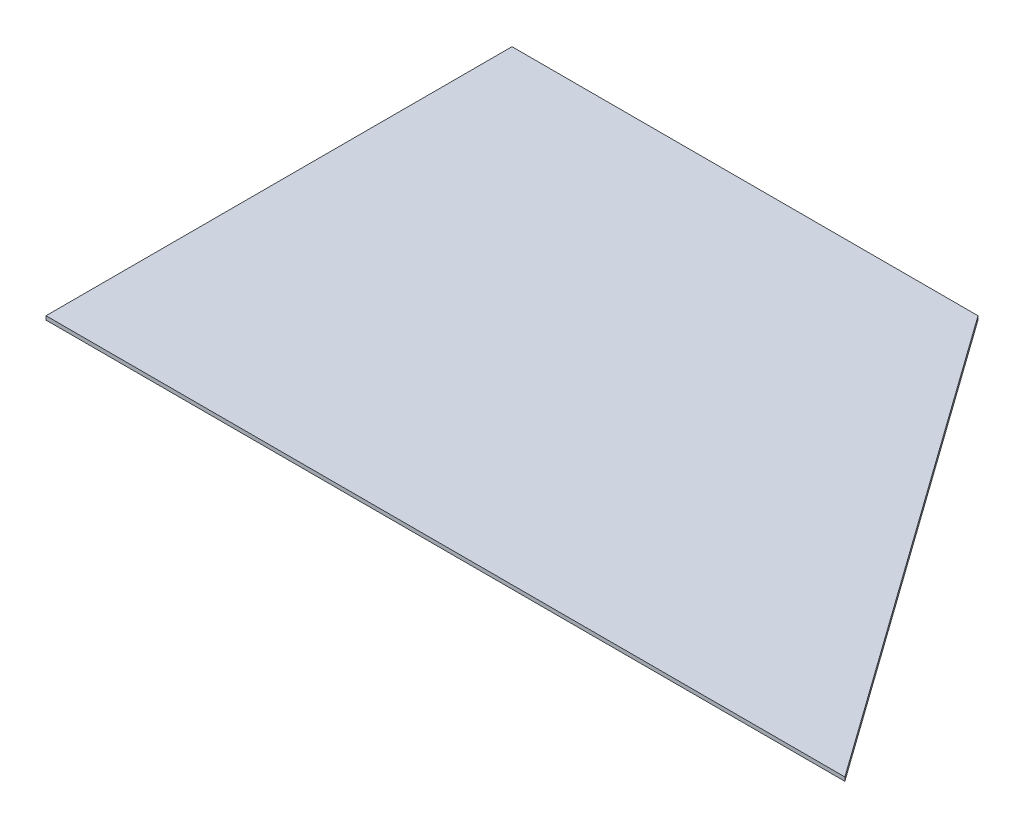
ISO-10303-21;
HEADER;
FILE_DESCRIPTION(('STEP AP214'),'2;1');
FILE_NAME('part.step','',(''),(''),'','','');
FILE_SCHEMA(('AUTOMOTIVE_DESIGN { 1 0 10303 214 1 1 1 1 }'));
ENDSEC;
DATA;
#1=APPLICATION_CONTEXT('core data for automotive mechanical design processes');
#2=APPLICATION_PROTOCOL_DEFINITION('international standard','automotive_design',2000,#1);
#3=PRODUCT_CONTEXT('',#1,'mechanical');
#4=PRODUCT('Part','Part','',(#3));
#5=PRODUCT_RELATED_PRODUCT_CATEGORY('part','',(#4));
#6=PRODUCT_DEFINITION_FORMATION('','',#4);
#7=PRODUCT_DEFINITION_CONTEXT('part definition',#1,'design');
#8=PRODUCT_DEFINITION('design','',#6,#7);
#9=PRODUCT_DEFINITION_SHAPE('','',#8);
#10=(LENGTH_UNIT() NAMED_UNIT(*) SI_UNIT(.MILLI.,.METRE.));
#11=(NAMED_UNIT(*) PLANE_ANGLE_UNIT() SI_UNIT($,.RADIAN.));
#12=(NAMED_UNIT(*) SI_UNIT($,.STERADIAN.) SOLID_ANGLE_UNIT());
#13=UNCERTAINTY_MEASURE_WITH_UNIT(LENGTH_MEASURE(1.E-05),#10,'distance_accuracy_value','');
#14=(GEOMETRIC_REPRESENTATION_CONTEXT(3) GLOBAL_UNCERTAINTY_ASSIGNED_CONTEXT((#13)) GLOBAL_UNIT_ASSIGNED_CONTEXT((#10,
#11,#12)) REPRESENTATION_CONTEXT('',''));
#15=CARTESIAN_POINT('',(0.,0.,0.));
#16=DIRECTION('',(0.,0.,1.));
#17=DIRECTION('',(1.,0.,0.));
#18=AXIS2_PLACEMENT_3D('',#15,#16,#17);
#19=CARTESIAN_POINT('',(-105.,1.,0.));
#20=DIRECTION('',(1.,0.,0.));
#21=DIRECTION('',(0.,0.,-1.));
#22=AXIS2_PLACEMENT_3D('',#19,#20,#21);
#23=PLANE('',#22);
#24=DIRECTION('',(0.,0.,1.));
#25=VECTOR('',#24,1.);
#26=CARTESIAN_POINT('',(-105.,0.,0.));
#27=LINE('',#26,#25);
#28=CARTESIAN_POINT('',(-105.,0.,-122.5));
#29=VERTEX_POINT('',#28);
#30=CARTESIAN_POINT('',(-105.,0.,0.));
#31=VERTEX_POINT('',#30);
#32=EDGE_CURVE('E87',#29,#31,#27,.T.);
#33=ORIENTED_EDGE('',*,*,#32,.T.);
#34=DIRECTION('',(0.,-1.,0.));
#35=VECTOR('',#34,1.);
#36=CARTESIAN_POINT('',(-105.,1.,0.));
#37=LINE('',#36,#35);
#38=CARTESIAN_POINT('',(-105.,1.,0.));
#39=VERTEX_POINT('',#38);
#40=EDGE_CURVE('E41',#39,#31,#37,.T.);
#41=ORIENTED_EDGE('',*,*,#40,.F.);
#42=DIRECTION('',(0.,0.,1.));
#43=VECTOR('',#42,1.);
#44=CARTESIAN_POINT('',(-105.,1.,0.));
#45=LINE('',#44,#43);
#46=CARTESIAN_POINT('',(-105.,1.,-122.5));
#47=VERTEX_POINT('',#46);
#48=EDGE_CURVE('E80',#47,#39,#45,.T.);
#49=ORIENTED_EDGE('',*,*,#48,.F.);
#50=DIRECTION('',(0.,-1.,0.));
#51=VECTOR('',#50,1.);
#52=CARTESIAN_POINT('',(-105.,1.,-122.5));
#53=LINE('',#52,#51);
#54=EDGE_CURVE('E11',#47,#29,#53,.T.);
#55=ORIENTED_EDGE('',*,*,#54,.T.);
#56=EDGE_LOOP('',(#33,#41,#49,#55));
#57=FACE_BOUND('',#56,.T.);
#58=ADVANCED_FACE('F33',(#57),#23,.F.);
#59=CARTESIAN_POINT('',(105.,1.,0.));
#60=DIRECTION('',(0.,0.,-1.));
#61=DIRECTION('',(-1.,0.,0.));
#62=AXIS2_PLACEMENT_3D('',#59,#60,#61);
#63=PLANE('',#62);
#64=DIRECTION('',(1.,0.,0.));
#65=VECTOR('',#64,1.);
#66=CARTESIAN_POINT('',(105.,0.,0.));
#67=LINE('',#66,#65);
#68=CARTESIAN_POINT('',(105.,0.,0.));
#69=VERTEX_POINT('',#68);
#70=EDGE_CURVE('E67',#31,#69,#67,.T.);
#71=ORIENTED_EDGE('',*,*,#70,.T.);
#72=DIRECTION('',(0.,-1.,0.));
#73=VECTOR('',#72,1.);
#74=CARTESIAN_POINT('',(105.,1.,0.));
#75=LINE('',#74,#73);
#76=CARTESIAN_POINT('',(105.,1.,0.));
#77=VERTEX_POINT('',#76);
#78=EDGE_CURVE('E88',#77,#69,#75,.T.);
#79=ORIENTED_EDGE('',*,*,#78,.F.);
#80=DIRECTION('',(1.,0.,0.));
#81=VECTOR('',#80,1.);
#82=CARTESIAN_POINT('',(105.,1.,0.));
#83=LINE('',#82,#81);
#84=EDGE_CURVE('E84',#39,#77,#83,.T.);
#85=ORIENTED_EDGE('',*,*,#84,.F.);
#86=ORIENTED_EDGE('',*,*,#40,.T.);
#87=EDGE_LOOP('',(#71,#79,#85,#86));
#88=FACE_BOUND('',#87,.T.);
#89=ADVANCED_FACE('F89',(#88),#63,.F.);
#90=CARTESIAN_POINT('',(17.5,1.,-122.5));
#91=DIRECTION('',(-0.813733471206735,0.,0.581238193719097));
#92=DIRECTION('',(0.581238193719097,0.,0.813733471206735));
#93=AXIS2_PLACEMENT_3D('',#90,#91,#92);
#94=PLANE('',#93);
#95=DIRECTION('',(-0.581238193719097,0.,-0.813733471206735));
#96=VECTOR('',#95,1.);
#97=CARTESIAN_POINT('',(17.5,0.,-122.5));
#98=LINE('',#97,#96);
#99=CARTESIAN_POINT('',(17.5,0.,-122.5));
#100=VERTEX_POINT('',#99);
#101=EDGE_CURVE('E74',#69,#100,#98,.T.);
#102=ORIENTED_EDGE('',*,*,#101,.T.);
#103=DIRECTION('',(0.,-1.,0.));
#104=VECTOR('',#103,1.);
#105=CARTESIAN_POINT('',(17.5,1.,-122.5));
#106=LINE('',#105,#104);
#107=CARTESIAN_POINT('',(17.5,1.,-122.5));
#108=VERTEX_POINT('',#107);
#109=EDGE_CURVE('E93',#108,#100,#106,.T.);
#110=ORIENTED_EDGE('',*,*,#109,.F.);
#111=DIRECTION('',(-0.581238193719097,0.,-0.813733471206735));
#112=VECTOR('',#111,1.);
#113=CARTESIAN_POINT('',(17.5,1.,-122.5));
#114=LINE('',#113,#112);
#115=EDGE_CURVE('E91',#77,#108,#114,.T.);
#116=ORIENTED_EDGE('',*,*,#115,.F.);
#117=ORIENTED_EDGE('',*,*,#78,.T.);
#118=EDGE_LOOP('',(#102,#110,#116,#117));
#119=FACE_BOUND('',#118,.T.);
#120=ADVANCED_FACE('F103',(#119),#94,.F.);
#121=CARTESIAN_POINT('',(-17.5,1.,-122.5));
#122=DIRECTION('',(0.,0.,1.));
#123=DIRECTION('',(1.,0.,0.));
#124=AXIS2_PLACEMENT_3D('',#121,#122,#123);
#125=PLANE('',#124);
#126=DIRECTION('',(-1.,0.,0.));
#127=VECTOR('',#126,1.);
#128=CARTESIAN_POINT('',(-17.5,0.,-122.5));
#129=LINE('',#128,#127);
#130=EDGE_CURVE('E100',#100,#29,#129,.T.);
#131=ORIENTED_EDGE('',*,*,#130,.T.);
#132=ORIENTED_EDGE('',*,*,#54,.F.);
#133=DIRECTION('',(-1.,0.,0.));
#134=VECTOR('',#133,1.);
#135=CARTESIAN_POINT('',(-105.,1.,-122.5));
#136=LINE('',#135,#134);
#137=EDGE_CURVE('E49',#108,#47,#136,.T.);
#138=ORIENTED_EDGE('',*,*,#137,.F.);
#139=ORIENTED_EDGE('',*,*,#109,.T.);
#140=EDGE_LOOP('',(#131,#132,#138,#139));
#141=FACE_BOUND('',#140,.T.);
#142=ADVANCED_FACE('F107',(#141),#125,.F.);
#143=CARTESIAN_POINT('',(0.,1.,0.));
#144=DIRECTION('',(0.,1.,0.));
#145=DIRECTION('',(0.,0.,1.));
#146=AXIS2_PLACEMENT_3D('',#143,#144,#145);
#147=PLANE('',#146);
#148=ORIENTED_EDGE('',*,*,#137,.T.);
#149=ORIENTED_EDGE('',*,*,#48,.T.);
#150=ORIENTED_EDGE('',*,*,#84,.T.);
#151=ORIENTED_EDGE('',*,*,#115,.T.);
#152=EDGE_LOOP('',(#148,#149,#150,#151));
#153=FACE_BOUND('',#152,.T.);
#154=ADVANCED_FACE('F82',(#153),#147,.T.);
#155=CARTESIAN_POINT('',(0.,0.,0.));
#156=DIRECTION('',(0.,1.,0.));
#157=DIRECTION('',(0.,0.,1.));
#158=AXIS2_PLACEMENT_3D('',#155,#156,#157);
#159=PLANE('',#158);
#160=ORIENTED_EDGE('',*,*,#32,.F.);
#161=ORIENTED_EDGE('',*,*,#130,.F.);
#162=ORIENTED_EDGE('',*,*,#101,.F.);
#163=ORIENTED_EDGE('',*,*,#70,.F.);
#164=EDGE_LOOP('',(#160,#161,#162,#163));
#165=FACE_BOUND('',#164,.T.);
#166=ADVANCED_FACE('F106',(#165),#159,.F.);
#167=CLOSED_SHELL('',(#58,#89,#120,#142,#154,#166));
#168=MANIFOLD_SOLID_BREP('B2',#167);
#169=ADVANCED_BREP_SHAPE_REPRESENTATION('',(#18,#168),#14);
#170=SHAPE_DEFINITION_REPRESENTATION(#9,#169);
ENDSEC;
END-ISO-10303-21;
